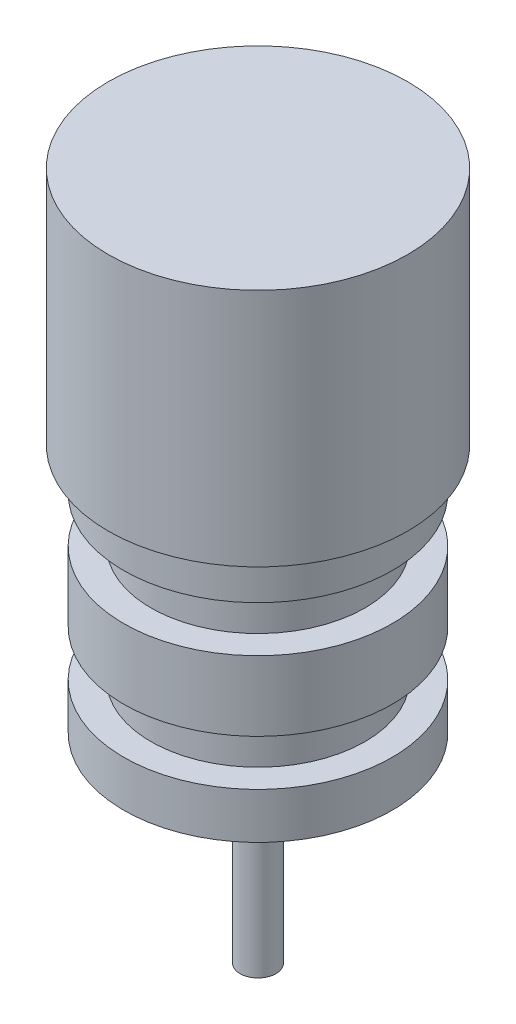
ISO-10303-21;
HEADER;
FILE_DESCRIPTION(('STEP AP214'),'2;1');
FILE_NAME('part.step','',(''),(''),'','','');
FILE_SCHEMA(('AUTOMOTIVE_DESIGN { 1 0 10303 214 1 1 1 1 }'));
ENDSEC;
DATA;
#1=APPLICATION_CONTEXT('core data for automotive mechanical design processes');
#2=APPLICATION_PROTOCOL_DEFINITION('international standard','automotive_design',2000,#1);
#3=PRODUCT_CONTEXT('',#1,'mechanical');
#4=PRODUCT('Part','Part','',(#3));
#5=PRODUCT_RELATED_PRODUCT_CATEGORY('part','',(#4));
#6=PRODUCT_DEFINITION_FORMATION('','',#4);
#7=PRODUCT_DEFINITION_CONTEXT('part definition',#1,'design');
#8=PRODUCT_DEFINITION('design','',#6,#7);
#9=PRODUCT_DEFINITION_SHAPE('','',#8);
#10=(LENGTH_UNIT() NAMED_UNIT(*) SI_UNIT(.MILLI.,.METRE.));
#11=(NAMED_UNIT(*) PLANE_ANGLE_UNIT() SI_UNIT($,.RADIAN.));
#12=(NAMED_UNIT(*) SI_UNIT($,.STERADIAN.) SOLID_ANGLE_UNIT());
#13=UNCERTAINTY_MEASURE_WITH_UNIT(LENGTH_MEASURE(1.E-05),#10,'distance_accuracy_value','');
#14=(GEOMETRIC_REPRESENTATION_CONTEXT(3) GLOBAL_UNCERTAINTY_ASSIGNED_CONTEXT((#13)) GLOBAL_UNIT_ASSIGNED_CONTEXT((#10,
#11,#12)) REPRESENTATION_CONTEXT('',''));
#15=CARTESIAN_POINT('',(0.,0.,0.));
#16=DIRECTION('',(0.,0.,1.));
#17=DIRECTION('',(1.,0.,0.));
#18=AXIS2_PLACEMENT_3D('',#15,#16,#17);
#19=CARTESIAN_POINT('',(0.,-20.,0.));
#20=DIRECTION('',(0.,1.,0.));
#21=DIRECTION('',(-1.,0.,0.));
#22=AXIS2_PLACEMENT_3D('',#19,#20,#21);
#23=PLANE('',#22);
#24=CARTESIAN_POINT('',(0.,-20.,0.));
#25=DIRECTION('',(0.,1.,0.));
#26=DIRECTION('',(-1.,0.,0.));
#27=AXIS2_PLACEMENT_3D('',#24,#25,#26);
#28=CIRCLE('',#27,1.8);
#29=CARTESIAN_POINT('',(-1.8,-20.,0.));
#30=VERTEX_POINT('',#29);
#31=EDGE_CURVE('E10',#30,#30,#28,.T.);
#32=ORIENTED_EDGE('',*,*,#31,.F.);
#33=EDGE_LOOP('',(#32));
#34=FACE_BOUND('',#33,.T.);
#35=ADVANCED_FACE('F35',(#34),#23,.F.);
#36=CARTESIAN_POINT('',(0.,49.,0.));
#37=DIRECTION('',(0.,1.,0.));
#38=DIRECTION('',(-1.,0.,0.));
#39=AXIS2_PLACEMENT_3D('',#36,#37,#38);
#40=CYLINDRICAL_SURFACE('',#39,1.8);
#41=CARTESIAN_POINT('',(0.,0.,0.));
#42=DIRECTION('',(0.,1.,0.));
#43=DIRECTION('',(-1.,0.,0.));
#44=AXIS2_PLACEMENT_3D('',#41,#42,#43);
#45=CIRCLE('',#44,1.8);
#46=CARTESIAN_POINT('',(-1.8,0.,0.));
#47=VERTEX_POINT('',#46);
#48=EDGE_CURVE('E41',#47,#47,#45,.T.);
#49=ORIENTED_EDGE('',*,*,#48,.F.);
#50=EDGE_LOOP('',(#49));
#51=FACE_BOUND('',#50,.T.);
#52=ORIENTED_EDGE('',*,*,#31,.T.);
#53=EDGE_LOOP('',(#52));
#54=FACE_BOUND('',#53,.T.);
#55=ADVANCED_FACE('F155',(#51,#54),#40,.T.);
#56=CARTESIAN_POINT('',(1.8,0.,0.));
#57=DIRECTION('',(0.,1.,0.));
#58=DIRECTION('',(-1.,0.,0.));
#59=AXIS2_PLACEMENT_3D('',#56,#57,#58);
#60=PLANE('',#59);
#61=CARTESIAN_POINT('',(0.,0.,0.));
#62=DIRECTION('',(0.,1.,0.));
#63=DIRECTION('',(-1.,0.,0.));
#64=AXIS2_PLACEMENT_3D('',#61,#62,#63);
#65=CIRCLE('',#64,13.45);
#66=CARTESIAN_POINT('',(-13.45,0.,0.));
#67=VERTEX_POINT('',#66);
#68=EDGE_CURVE('E45',#67,#67,#65,.T.);
#69=ORIENTED_EDGE('',*,*,#68,.F.);
#70=EDGE_LOOP('',(#69));
#71=FACE_BOUND('',#70,.T.);
#72=ORIENTED_EDGE('',*,*,#48,.T.);
#73=EDGE_LOOP('',(#72));
#74=FACE_BOUND('',#73,.T.);
#75=ADVANCED_FACE('F150',(#71,#74),#60,.F.);
#76=CARTESIAN_POINT('',(0.,49.,0.));
#77=DIRECTION('',(0.,1.,0.));
#78=DIRECTION('',(-1.,0.,0.));
#79=AXIS2_PLACEMENT_3D('',#76,#77,#78);
#80=CYLINDRICAL_SURFACE('',#79,13.45);
#81=CARTESIAN_POINT('',(0.,4.6,0.));
#82=DIRECTION('',(0.,1.,0.));
#83=DIRECTION('',(-1.,0.,0.));
#84=AXIS2_PLACEMENT_3D('',#81,#82,#83);
#85=CIRCLE('',#84,13.45);
#86=CARTESIAN_POINT('',(-13.45,4.6,0.));
#87=VERTEX_POINT('',#86);
#88=EDGE_CURVE('E49',#87,#87,#85,.T.);
#89=ORIENTED_EDGE('',*,*,#88,.F.);
#90=EDGE_LOOP('',(#89));
#91=FACE_BOUND('',#90,.T.);
#92=ORIENTED_EDGE('',*,*,#68,.T.);
#93=EDGE_LOOP('',(#92));
#94=FACE_BOUND('',#93,.T.);
#95=ADVANCED_FACE('F144',(#91,#94),#80,.T.);
#96=CARTESIAN_POINT('',(10.73,4.6,0.));
#97=DIRECTION('',(0.,-1.,0.));
#98=DIRECTION('',(1.,0.,0.));
#99=AXIS2_PLACEMENT_3D('',#96,#97,#98);
#100=PLANE('',#99);
#101=CARTESIAN_POINT('',(0.,4.6,0.));
#102=DIRECTION('',(0.,1.,0.));
#103=DIRECTION('',(-1.,0.,0.));
#104=AXIS2_PLACEMENT_3D('',#101,#102,#103);
#105=CIRCLE('',#104,10.73);
#106=CARTESIAN_POINT('',(-10.73,4.6,0.));
#107=VERTEX_POINT('',#106);
#108=EDGE_CURVE('E54',#107,#107,#105,.T.);
#109=ORIENTED_EDGE('',*,*,#108,.F.);
#110=EDGE_LOOP('',(#109));
#111=FACE_BOUND('',#110,.T.);
#112=ORIENTED_EDGE('',*,*,#88,.T.);
#113=EDGE_LOOP('',(#112));
#114=FACE_BOUND('',#113,.T.);
#115=ADVANCED_FACE('F138',(#111,#114),#100,.F.);
#116=CARTESIAN_POINT('',(0.,49.,0.));
#117=DIRECTION('',(0.,1.,0.));
#118=DIRECTION('',(-1.,0.,0.));
#119=AXIS2_PLACEMENT_3D('',#116,#117,#118);
#120=CYLINDRICAL_SURFACE('',#119,10.73);
#121=CARTESIAN_POINT('',(0.,9.2,0.));
#122=DIRECTION('',(0.,1.,0.));
#123=DIRECTION('',(-1.,0.,0.));
#124=AXIS2_PLACEMENT_3D('',#121,#122,#123);
#125=CIRCLE('',#124,10.73);
#126=CARTESIAN_POINT('',(-10.73,9.2,0.));
#127=VERTEX_POINT('',#126);
#128=EDGE_CURVE('E57',#127,#127,#125,.T.);
#129=ORIENTED_EDGE('',*,*,#128,.F.);
#130=EDGE_LOOP('',(#129));
#131=FACE_BOUND('',#130,.T.);
#132=ORIENTED_EDGE('',*,*,#108,.T.);
#133=EDGE_LOOP('',(#132));
#134=FACE_BOUND('',#133,.T.);
#135=ADVANCED_FACE('F132',(#131,#134),#120,.T.);
#136=CARTESIAN_POINT('',(13.45,9.2,0.));
#137=DIRECTION('',(0.,1.,0.));
#138=DIRECTION('',(-1.,0.,0.));
#139=AXIS2_PLACEMENT_3D('',#136,#137,#138);
#140=PLANE('',#139);
#141=CARTESIAN_POINT('',(0.,9.2,0.));
#142=DIRECTION('',(0.,1.,0.));
#143=DIRECTION('',(-1.,0.,0.));
#144=AXIS2_PLACEMENT_3D('',#141,#142,#143);
#145=CIRCLE('',#144,13.45);
#146=CARTESIAN_POINT('',(-13.45,9.2,0.));
#147=VERTEX_POINT('',#146);
#148=EDGE_CURVE('E60',#147,#147,#145,.T.);
#149=ORIENTED_EDGE('',*,*,#148,.F.);
#150=EDGE_LOOP('',(#149));
#151=FACE_BOUND('',#150,.T.);
#152=ORIENTED_EDGE('',*,*,#128,.T.);
#153=EDGE_LOOP('',(#152));
#154=FACE_BOUND('',#153,.T.);
#155=ADVANCED_FACE('F126',(#151,#154),#140,.F.);
#156=CARTESIAN_POINT('',(0.,49.,0.));
#157=DIRECTION('',(0.,1.,0.));
#158=DIRECTION('',(-1.,0.,0.));
#159=AXIS2_PLACEMENT_3D('',#156,#157,#158);
#160=CYLINDRICAL_SURFACE('',#159,13.45);
#161=CARTESIAN_POINT('',(0.,16.2,0.));
#162=DIRECTION('',(0.,1.,0.));
#163=DIRECTION('',(-1.,0.,0.));
#164=AXIS2_PLACEMENT_3D('',#161,#162,#163);
#165=CIRCLE('',#164,13.45);
#166=CARTESIAN_POINT('',(-13.45,16.2,0.));
#167=VERTEX_POINT('',#166);
#168=EDGE_CURVE('E63',#167,#167,#165,.T.);
#169=ORIENTED_EDGE('',*,*,#168,.F.);
#170=EDGE_LOOP('',(#169));
#171=FACE_BOUND('',#170,.T.);
#172=ORIENTED_EDGE('',*,*,#148,.T.);
#173=EDGE_LOOP('',(#172));
#174=FACE_BOUND('',#173,.T.);
#175=ADVANCED_FACE('F120',(#171,#174),#160,.T.);
#176=CARTESIAN_POINT('',(10.73,16.2,0.));
#177=DIRECTION('',(0.,-1.,0.));
#178=DIRECTION('',(1.,0.,0.));
#179=AXIS2_PLACEMENT_3D('',#176,#177,#178);
#180=PLANE('',#179);
#181=CARTESIAN_POINT('',(0.,16.2,0.));
#182=DIRECTION('',(0.,1.,0.));
#183=DIRECTION('',(-1.,0.,0.));
#184=AXIS2_PLACEMENT_3D('',#181,#182,#183);
#185=CIRCLE('',#184,10.73);
#186=CARTESIAN_POINT('',(-10.73,16.2,0.));
#187=VERTEX_POINT('',#186);
#188=EDGE_CURVE('E66',#187,#187,#185,.T.);
#189=ORIENTED_EDGE('',*,*,#188,.F.);
#190=EDGE_LOOP('',(#189));
#191=FACE_BOUND('',#190,.T.);
#192=ORIENTED_EDGE('',*,*,#168,.T.);
#193=EDGE_LOOP('',(#192));
#194=FACE_BOUND('',#193,.T.);
#195=ADVANCED_FACE('F114',(#191,#194),#180,.F.);
#196=CARTESIAN_POINT('',(0.,49.,0.));
#197=DIRECTION('',(0.,1.,0.));
#198=DIRECTION('',(-1.,0.,0.));
#199=AXIS2_PLACEMENT_3D('',#196,#197,#198);
#200=CYLINDRICAL_SURFACE('',#199,10.73);
#201=CARTESIAN_POINT('',(0.,20.8,0.));
#202=DIRECTION('',(0.,1.,0.));
#203=DIRECTION('',(-1.,0.,0.));
#204=AXIS2_PLACEMENT_3D('',#201,#202,#203);
#205=CIRCLE('',#204,10.73);
#206=CARTESIAN_POINT('',(-10.73,20.8,0.));
#207=VERTEX_POINT('',#206);
#208=EDGE_CURVE('E69',#207,#207,#205,.T.);
#209=ORIENTED_EDGE('',*,*,#208,.F.);
#210=EDGE_LOOP('',(#209));
#211=FACE_BOUND('',#210,.T.);
#212=ORIENTED_EDGE('',*,*,#188,.T.);
#213=EDGE_LOOP('',(#212));
#214=FACE_BOUND('',#213,.T.);
#215=ADVANCED_FACE('F108',(#211,#214),#200,.T.);
#216=CARTESIAN_POINT('',(13.45,20.8,0.));
#217=DIRECTION('',(0.,1.,0.));
#218=DIRECTION('',(-1.,0.,0.));
#219=AXIS2_PLACEMENT_3D('',#216,#217,#218);
#220=PLANE('',#219);
#221=CARTESIAN_POINT('',(0.,20.8,0.));
#222=DIRECTION('',(0.,1.,0.));
#223=DIRECTION('',(-1.,0.,0.));
#224=AXIS2_PLACEMENT_3D('',#221,#222,#223);
#225=CIRCLE('',#224,13.45);
#226=CARTESIAN_POINT('',(-13.45,20.8,0.));
#227=VERTEX_POINT('',#226);
#228=EDGE_CURVE('E72',#227,#227,#225,.T.);
#229=ORIENTED_EDGE('',*,*,#228,.F.);
#230=EDGE_LOOP('',(#229));
#231=FACE_BOUND('',#230,.T.);
#232=ORIENTED_EDGE('',*,*,#208,.T.);
#233=EDGE_LOOP('',(#232));
#234=FACE_BOUND('',#233,.T.);
#235=ADVANCED_FACE('F102',(#231,#234),#220,.F.);
#236=CARTESIAN_POINT('',(0.,49.,0.));
#237=DIRECTION('',(0.,1.,0.));
#238=DIRECTION('',(-1.,0.,0.));
#239=AXIS2_PLACEMENT_3D('',#236,#237,#238);
#240=CYLINDRICAL_SURFACE('',#239,13.45);
#241=CARTESIAN_POINT('',(0.,25.,0.));
#242=DIRECTION('',(0.,1.,0.));
#243=DIRECTION('',(-1.,0.,0.));
#244=AXIS2_PLACEMENT_3D('',#241,#242,#243);
#245=CIRCLE('',#244,13.45);
#246=CARTESIAN_POINT('',(-13.45,25.,0.));
#247=VERTEX_POINT('',#246);
#248=EDGE_CURVE('E75',#247,#247,#245,.T.);
#249=ORIENTED_EDGE('',*,*,#248,.F.);
#250=EDGE_LOOP('',(#249));
#251=FACE_BOUND('',#250,.T.);
#252=ORIENTED_EDGE('',*,*,#228,.T.);
#253=EDGE_LOOP('',(#252));
#254=FACE_BOUND('',#253,.T.);
#255=ADVANCED_FACE('F96',(#251,#254),#240,.T.);
#256=CARTESIAN_POINT('',(13.45,25.,0.));
#257=DIRECTION('',(0.,1.,0.));
#258=DIRECTION('',(-1.,0.,0.));
#259=AXIS2_PLACEMENT_3D('',#256,#257,#258);
#260=PLANE('',#259);
#261=CARTESIAN_POINT('',(0.,25.,0.));
#262=DIRECTION('',(0.,1.,0.));
#263=DIRECTION('',(-1.,0.,0.));
#264=AXIS2_PLACEMENT_3D('',#261,#262,#263);
#265=CIRCLE('',#264,15.);
#266=CARTESIAN_POINT('',(-15.,25.,0.));
#267=VERTEX_POINT('',#266);
#268=EDGE_CURVE('E78',#267,#267,#265,.T.);
#269=ORIENTED_EDGE('',*,*,#268,.F.);
#270=EDGE_LOOP('',(#269));
#271=FACE_BOUND('',#270,.T.);
#272=ORIENTED_EDGE('',*,*,#248,.T.);
#273=EDGE_LOOP('',(#272));
#274=FACE_BOUND('',#273,.T.);
#275=ADVANCED_FACE('F90',(#271,#274),#260,.F.);
#276=CARTESIAN_POINT('',(0.,49.,0.));
#277=DIRECTION('',(0.,1.,0.));
#278=DIRECTION('',(-1.,0.,0.));
#279=AXIS2_PLACEMENT_3D('',#276,#277,#278);
#280=CYLINDRICAL_SURFACE('',#279,15.);
#281=CARTESIAN_POINT('',(0.,49.,0.));
#282=DIRECTION('',(0.,1.,0.));
#283=DIRECTION('',(-1.,0.,0.));
#284=AXIS2_PLACEMENT_3D('',#281,#282,#283);
#285=CIRCLE('',#284,15.);
#286=CARTESIAN_POINT('',(-15.,49.,0.));
#287=VERTEX_POINT('',#286);
#288=EDGE_CURVE('E81',#287,#287,#285,.T.);
#289=ORIENTED_EDGE('',*,*,#288,.F.);
#290=EDGE_LOOP('',(#289));
#291=FACE_BOUND('',#290,.T.);
#292=ORIENTED_EDGE('',*,*,#268,.T.);
#293=EDGE_LOOP('',(#292));
#294=FACE_BOUND('',#293,.T.);
#295=ADVANCED_FACE('F87',(#291,#294),#280,.T.);
#296=CARTESIAN_POINT('',(15.,49.,0.));
#297=DIRECTION('',(0.,-1.,0.));
#298=DIRECTION('',(1.,0.,0.));
#299=AXIS2_PLACEMENT_3D('',#296,#297,#298);
#300=PLANE('',#299);
#301=ORIENTED_EDGE('',*,*,#288,.T.);
#302=EDGE_LOOP('',(#301));
#303=FACE_BOUND('',#302,.T.);
#304=ADVANCED_FACE('F85',(#303),#300,.F.);
#305=CLOSED_SHELL('',(#35,#55,#75,#95,#115,#135,#155,#175,#195,#215,#235,#255,#275,#295,#304));
#306=MANIFOLD_SOLID_BREP('B2',#305);
#307=ADVANCED_BREP_SHAPE_REPRESENTATION('',(#18,#306),#14);
#308=SHAPE_DEFINITION_REPRESENTATION(#9,#307);
ENDSEC;
END-ISO-10303-21;
